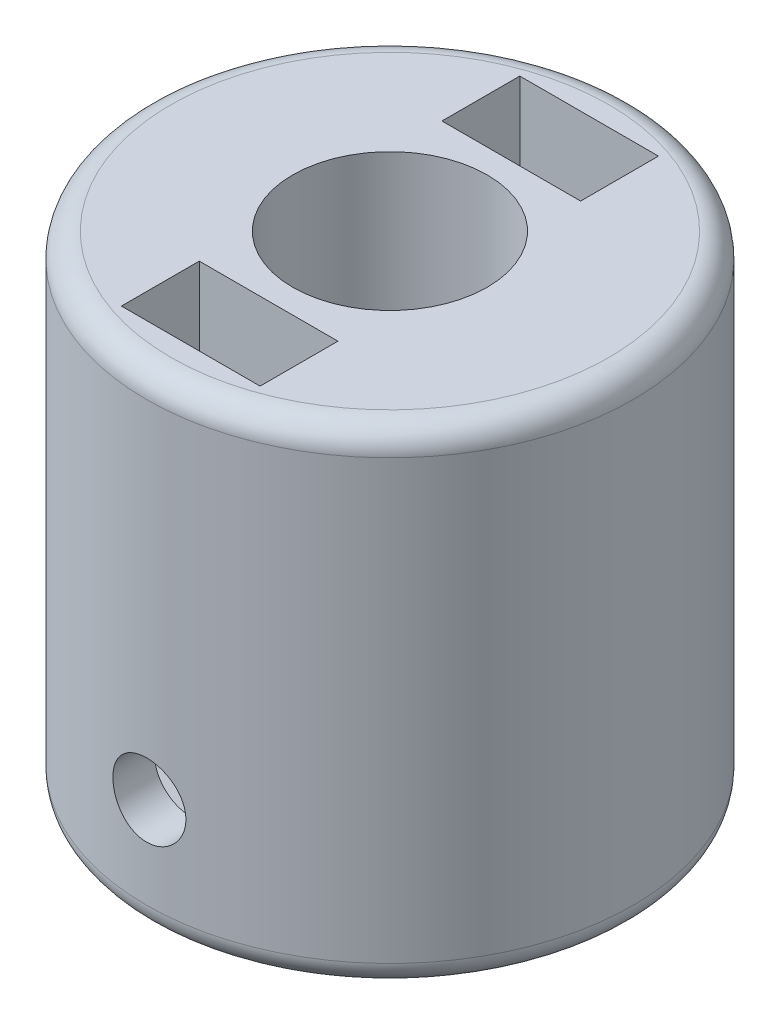
ISO-10303-21;
HEADER;
FILE_DESCRIPTION(('STEP AP214'),'2;1');
FILE_NAME('part.step','',(''),(''),'','','');
FILE_SCHEMA(('AUTOMOTIVE_DESIGN { 1 0 10303 214 1 1 1 1 }'));
ENDSEC;
DATA;
#1=APPLICATION_CONTEXT('core data for automotive mechanical design processes');
#2=APPLICATION_PROTOCOL_DEFINITION('international standard','automotive_design',2000,#1);
#3=PRODUCT_CONTEXT('',#1,'mechanical');
#4=PRODUCT('Part','Part','',(#3));
#5=PRODUCT_RELATED_PRODUCT_CATEGORY('part','',(#4));
#6=PRODUCT_DEFINITION_FORMATION('','',#4);
#7=PRODUCT_DEFINITION_CONTEXT('part definition',#1,'design');
#8=PRODUCT_DEFINITION('design','',#6,#7);
#9=PRODUCT_DEFINITION_SHAPE('','',#8);
#10=(LENGTH_UNIT() NAMED_UNIT(*) SI_UNIT(.MILLI.,.METRE.));
#11=(NAMED_UNIT(*) PLANE_ANGLE_UNIT() SI_UNIT($,.RADIAN.));
#12=(NAMED_UNIT(*) SI_UNIT($,.STERADIAN.) SOLID_ANGLE_UNIT());
#13=UNCERTAINTY_MEASURE_WITH_UNIT(LENGTH_MEASURE(1.E-05),#10,'distance_accuracy_value','');
#14=(GEOMETRIC_REPRESENTATION_CONTEXT(3) GLOBAL_UNCERTAINTY_ASSIGNED_CONTEXT((#13)) GLOBAL_UNIT_ASSIGNED_CONTEXT((#10,
#11,#12)) REPRESENTATION_CONTEXT('',''));
#15=CARTESIAN_POINT('',(0.,0.,0.));
#16=DIRECTION('',(0.,0.,1.));
#17=DIRECTION('',(1.,0.,0.));
#18=AXIS2_PLACEMENT_3D('',#15,#16,#17);
#19=CARTESIAN_POINT('',(0.,20.,0.));
#20=DIRECTION('',(0.,-1.,0.));
#21=DIRECTION('',(0.,0.,-1.));
#22=AXIS2_PLACEMENT_3D('',#19,#20,#21);
#23=CYLINDRICAL_SURFACE('',#22,10.);
#24=CARTESIAN_POINT('',(0.,1.,0.));
#25=DIRECTION('',(0.,1.,0.));
#26=DIRECTION('',(0.,0.,1.));
#27=AXIS2_PLACEMENT_3D('',#24,#25,#26);
#28=CIRCLE('',#27,10.);
#29=CARTESIAN_POINT('',(0.,1.,10.));
#30=VERTEX_POINT('',#29);
#31=EDGE_CURVE('E247',#30,#30,#28,.T.);
#32=ORIENTED_EDGE('',*,*,#31,.T.);
#33=EDGE_LOOP('',(#32));
#34=FACE_BOUND('',#33,.T.);
#35=CARTESIAN_POINT('',(0.,19.,0.));
#36=DIRECTION('',(0.,1.,0.));
#37=DIRECTION('',(0.,0.,1.));
#38=AXIS2_PLACEMENT_3D('',#35,#36,#37);
#39=CIRCLE('',#38,10.);
#40=CARTESIAN_POINT('',(0.,19.,10.));
#41=VERTEX_POINT('',#40);
#42=EDGE_CURVE('E240',#41,#41,#39,.F.);
#43=ORIENTED_EDGE('',*,*,#42,.T.);
#44=EDGE_LOOP('',(#43));
#45=FACE_BOUND('',#44,.T.);
#46=CARTESIAN_POINT('',(0.,15.3368070885338,-10.));
#47=CARTESIAN_POINT('',(0.083751544481642,15.3368036347185,-9.99999865771297));
#48=CARTESIAN_POINT('',(0.167551685082132,15.3297690876931,-9.9989368253704));
#49=CARTESIAN_POINT('',(0.332809627994913,15.301823888551,-9.99480315973187));
#50=CARTESIAN_POINT('',(0.414265068974229,15.2808997255889,-9.99172936938473));
#51=CARTESIAN_POINT('',(0.572418086221859,15.2258145835661,-9.98391721219526));
#52=CARTESIAN_POINT('',(0.649119207826798,15.1916636090278,-9.97918010370919));
#53=CARTESIAN_POINT('',(0.795690428635253,15.1111187091169,-9.96856475911724));
#54=CARTESIAN_POINT('',(0.865561474725188,15.0647264841164,-9.96268668152773));
#55=CARTESIAN_POINT('',(0.997046719562125,14.9606298235939,-9.95039170991452));
#56=CARTESIAN_POINT('',(1.0585998322255,14.9028486323256,-9.94397133890331));
#57=CARTESIAN_POINT('',(1.17117490668948,14.7777793996399,-9.93134261133238));
#58=CARTESIAN_POINT('',(1.22219626272936,14.7104908117552,-9.92513426698505));
#59=CARTESIAN_POINT('',(1.31249729499943,14.5679064450113,-9.91359877458726));
#60=CARTESIAN_POINT('',(1.35171787037205,14.4925728415524,-9.90827611975031));
#61=CARTESIAN_POINT('',(1.41692632171056,14.3362942678883,-9.89916211306268));
#62=CARTESIAN_POINT('',(1.44291491889163,14.2553496037899,-9.89537067775449));
#63=CARTESIAN_POINT('',(1.48073198798911,14.0907890466621,-9.88978256218673));
#64=CARTESIAN_POINT('',(1.49266503640518,14.0071976951257,-9.8879711574125));
#65=CARTESIAN_POINT('',(1.50235624033932,13.8391809225465,-9.88650348970582));
#66=CARTESIAN_POINT('',(1.50011520973796,13.7547555496713,-9.88684710303147));
#67=CARTESIAN_POINT('',(1.48160733250788,13.5882060083396,-9.88963718352409));
#68=CARTESIAN_POINT('',(1.4654569592775,13.506068562049,-9.89206618761549));
#69=CARTESIAN_POINT('',(1.41977117403734,13.3456827196622,-9.89872608126367));
#70=CARTESIAN_POINT('',(1.39023538337812,13.267434433653,-9.90295702179379));
#71=CARTESIAN_POINT('',(1.31849603529736,13.1166937172509,-9.91276335545481));
#72=CARTESIAN_POINT('',(1.27624314283198,13.0442251194414,-9.91834396766526));
#73=CARTESIAN_POINT('',(1.18030413128955,12.9073624927518,-9.93021707574548));
#74=CARTESIAN_POINT('',(1.12661726182478,12.8429689942644,-9.93650961832501));
#75=CARTESIAN_POINT('',(1.00869493078248,12.7234094277941,-9.94917473056209));
#76=CARTESIAN_POINT('',(0.944359329642002,12.6683420982474,-9.95554747112815));
#77=CARTESIAN_POINT('',(0.807307089894187,12.5697711540265,-9.96759647648462));
#78=CARTESIAN_POINT('',(0.734590414588171,12.5262675899899,-9.9732727382251));
#79=CARTESIAN_POINT('',(0.582754598213687,12.4520540020342,-9.98329515585393));
#80=CARTESIAN_POINT('',(0.503631677836781,12.4213515966935,-9.98764051925428));
#81=CARTESIAN_POINT('',(0.341273182487062,12.3736976988484,-9.99450490557069));
#82=CARTESIAN_POINT('',(0.258037885952602,12.3567452767182,-9.99702405195467));
#83=CARTESIAN_POINT('',(0.0906695676436471,12.3372038587171,-9.99993581133871));
#84=CARTESIAN_POINT('',(0.00655273187047109,12.3344791171544,-10.0003485209039));
#85=CARTESIAN_POINT('',(-0.160936677662282,12.3431100938448,-9.99905561015226));
#86=CARTESIAN_POINT('',(-0.244309274381876,12.3544653762019,-9.99735005541368));
#87=CARTESIAN_POINT('',(-0.407532387431407,12.3908211887113,-9.99202468615333));
#88=CARTESIAN_POINT('',(-0.487397963079837,12.4157555845646,-9.98841415207984));
#89=CARTESIAN_POINT('',(-0.641814958642999,12.4784920859955,-9.97968235658369));
#90=CARTESIAN_POINT('',(-0.716366128795099,12.5162947958674,-9.97456102421565));
#91=CARTESIAN_POINT('',(-0.85863497929192,12.6040133130976,-9.96332682468686));
#92=CARTESIAN_POINT('',(-0.926299009891565,12.6540152285465,-9.95720701626745));
#93=CARTESIAN_POINT('',(-1.05232367317771,12.7645929001625,-9.94467863012165));
#94=CARTESIAN_POINT('',(-1.1106837647934,12.8251692708584,-9.93827003562867));
#95=CARTESIAN_POINT('',(-1.21693784957195,12.9557806217103,-9.92582264304494));
#96=CARTESIAN_POINT('',(-1.26474084747421,13.0258900137285,-9.91978736017588));
#97=CARTESIAN_POINT('',(-1.34789129270584,13.1732231290455,-9.90883219104903));
#98=CARTESIAN_POINT('',(-1.38323907656436,13.2504466600552,-9.90391227465628));
#99=CARTESIAN_POINT('',(-1.44033467323943,13.4095446221569,-9.89577033008645));
#100=CARTESIAN_POINT('',(-1.46213037141635,13.491401549505,-9.89254233006438));
#101=CARTESIAN_POINT('',(-1.49165549501586,13.6576661039689,-9.88813382297802));
#102=CARTESIAN_POINT('',(-1.49938589183066,13.7420735545284,-9.88695317451771));
#103=CARTESIAN_POINT('',(-1.5005378666944,13.9101361518495,-9.88677832610841));
#104=CARTESIAN_POINT('',(-1.49410252167313,13.9937903302907,-9.88776226333502));
#105=CARTESIAN_POINT('',(-1.46741229544379,14.1588123518573,-9.89175820611174));
#106=CARTESIAN_POINT('',(-1.44715743638627,14.2401801986472,-9.89477020841118));
#107=CARTESIAN_POINT('',(-1.39345373518665,14.3982801707681,-9.90247526112297));
#108=CARTESIAN_POINT('',(-1.36001489324314,14.4750157589672,-9.90716703716075));
#109=CARTESIAN_POINT('',(-1.28090667642309,14.6218107223362,-9.91770454557702));
#110=CARTESIAN_POINT('',(-1.23523688741502,14.6918698713374,-9.92355031702724));
#111=CARTESIAN_POINT('',(-1.13244337659164,14.8240501465089,-9.93580743364938));
#112=CARTESIAN_POINT('',(-1.07521369039806,14.8860884217808,-9.94222367881967));
#113=CARTESIAN_POINT('',(-0.951148841082836,14.9997316433216,-9.95485788826636));
#114=CARTESIAN_POINT('',(-0.884311448350942,15.0513341611099,-9.96107580610759));
#115=CARTESIAN_POINT('',(-0.742495707543722,15.1428947651411,-9.9726518579052));
#116=CARTESIAN_POINT('',(-0.667474576764761,15.1827871977485,-9.9780050712882));
#117=CARTESIAN_POINT('',(-0.51175187024872,15.2493456052918,-9.98720028802959));
#118=CARTESIAN_POINT('',(-0.431056277096705,15.2760252785875,-9.99104385565757));
#119=CARTESIAN_POINT('',(-0.29166572788933,15.3093484312439,-9.99590939261505));
#120=CARTESIAN_POINT('',(-0.233831133495279,15.3196296900726,-9.99743549179557));
#121=CARTESIAN_POINT('',(-0.117338971600125,15.3333601862464,-9.99948125947896));
#122=CARTESIAN_POINT('',(-0.0586814143344171,15.3368095084863,-10.0000009404877));
#123=CARTESIAN_POINT('',(0.,15.3368070885338,-10.));
#124=B_SPLINE_CURVE_WITH_KNOTS('',3,(#46,#47,#48,#49,#50,#51,#52,#53,#54,#55,#56,#57,#58,#59,
#60,#61,#62,#63,#64,#65,#66,#67,#68,#69,#70,#71,#72,#73,#74,#75,#76,#77,#78,#79,#80,#81,#82,#83,
#84,#85,#86,#87,#88,#89,#90,#91,#92,#93,#94,#95,#96,#97,#98,#99,#100,#101,#102,#103,#104,#105,
#106,#107,#108,#109,#110,#111,#112,#113,#114,#115,#116,#117,#118,#119,#120,#121,#122,#123),
.UNSPECIFIED.,.T.,.F.,(4,2,2,2,2,2,2,2,2,2,2,2,2,2,2,2,2,2,2,2,2,2,2,2,2,2,2,2,2,2,2,2,2,2,2,2,
2,2,4),(0.,0.251040205031663,0.50232496292915,0.753420023583236,1.0044802241976,
1.25729416136843,1.5101226357258,1.76419702395375,2.01825756225506,2.27041564605924,
2.52255925098982,2.77261177195746,3.02267136690361,3.27371383476159,3.52477278308534,
3.77834291255408,4.03191415238668,4.28563608984874,4.53934087193401,4.79062058544255,
5.04189251991155,5.29195148965948,5.54202220376273,5.79391188036907,6.04581620028629,
6.29981366584672,6.55380426808832,6.80689223457168,7.05996272137176,7.31048888261064,
7.56101464229564,7.81135073984146,8.06169531466879,8.3144482996572,8.56726003468733,
8.82146323384733,9.07540233261441,9.25129851978808,9.42719252123291),.UNSPECIFIED.);
#125=CARTESIAN_POINT('',(0.,15.3368070885338,-10.));
#126=VERTEX_POINT('',#125);
#127=EDGE_CURVE('E273',#126,#126,#124,.T.);
#128=ORIENTED_EDGE('',*,*,#127,.F.);
#129=EDGE_LOOP('',(#128));
#130=FACE_BOUND('',#129,.T.);
#131=CARTESIAN_POINT('',(-1.50000000000001,4.74830377210179,9.88685996664259));
#132=CARTESIAN_POINT('',(-1.49999654107285,4.66455820281184,9.88686136668593));
#133=CARTESIAN_POINT('',(-1.49296296388492,4.58076402135108,9.88793551739101));
#134=CARTESIAN_POINT('',(-1.46502196657002,4.41551845721866,9.8921131480324));
#135=CARTESIAN_POINT('',(-1.44410101402629,4.33406944062178,9.8952186073143));
#136=CARTESIAN_POINT('',(-1.38902526098085,4.17593001665489,9.90309938986228));
#137=CARTESIAN_POINT('',(-1.35488061681398,4.09923600955963,9.90787343131536));
#138=CARTESIAN_POINT('',(-1.27435063087792,3.95267674132971,9.91855194113145));
#139=CARTESIAN_POINT('',(-1.22796697429873,3.88281054188749,9.92445625383668));
#140=CARTESIAN_POINT('',(-1.12387902418559,3.75131995534746,9.93678289248039));
#141=CARTESIAN_POINT('',(-1.06609605584821,3.68975815869505,9.94320862458057));
#142=CARTESIAN_POINT('',(-0.941019605444382,3.57716628644629,9.95582368169047));
#143=CARTESIAN_POINT('',(-0.873725600786538,3.5261367899348,9.96201299368615));
#144=CARTESIAN_POINT('',(-0.731136358052753,3.43582714041043,9.97349347428185));
#145=CARTESIAN_POINT('',(-0.655804227365775,3.39660462177933,9.97878018435569));
#146=CARTESIAN_POINT('',(-0.499528850106983,3.33139217329361,9.98782206746405));
#147=CARTESIAN_POINT('',(-0.418585900270685,3.3054015442589,9.99157732141944));
#148=CARTESIAN_POINT('',(-0.254031123090578,3.26758038357095,9.99710914797782));
#149=CARTESIAN_POINT('',(-0.170443884389875,3.25564504571463,9.99890035887344));
#150=CARTESIAN_POINT('',(-0.00243520401948738,3.24594783727689,10.0003524476958));
#151=CARTESIAN_POINT('',(0.081986191015738,3.2481851787821,10.0000134440494));
#152=CARTESIAN_POINT('',(0.248551718200512,3.26668710986422,9.99725499660796));
#153=CARTESIAN_POINT('',(0.3307086914,3.28283894389327,9.99485227652479));
#154=CARTESIAN_POINT('',(0.49113282914313,3.32853437842437,9.98825500227851));
#155=CARTESIAN_POINT('',(0.569399893513473,3.35807832360323,9.98406040199739));
#156=CARTESIAN_POINT('',(0.720163780770309,3.42983476901889,9.97432193873206));
#157=CARTESIAN_POINT('',(0.792637672323588,3.47209473721053,9.96877303515638));
#158=CARTESIAN_POINT('',(0.929507907150169,3.56804896577178,9.95694438245421));
#159=CARTESIAN_POINT('',(0.993903718271727,3.62174397880866,9.95066458523184));
#160=CARTESIAN_POINT('',(1.11345448272264,3.73967222092838,9.93800158192627));
#161=CARTESIAN_POINT('',(1.16851232950946,3.8040038940719,9.93161796623257));
#162=CARTESIAN_POINT('',(1.26706599338812,3.94104484922553,9.91952704453523));
#163=CARTESIAN_POINT('',(1.31056173927998,4.01375418282171,9.91381974269649));
#164=CARTESIAN_POINT('',(1.38476964534604,4.16558773504243,9.90372775286855));
#165=CARTESIAN_POINT('',(1.41547182270081,4.24471690576418,9.89934409845291));
#166=CARTESIAN_POINT('',(1.46312336208878,4.40708902724918,9.89241402899059));
#167=CARTESIAN_POINT('',(1.48007369337325,4.49033168764854,9.88986748446299));
#168=CARTESIAN_POINT('',(1.49960720086655,4.65770386167928,9.88692451395027));
#169=CARTESIAN_POINT('',(1.50232803265051,4.74181696030332,9.88650748802574));
#170=CARTESIAN_POINT('',(1.49369057019818,4.90929796691913,9.88781607937153));
#171=CARTESIAN_POINT('',(1.48233271282301,4.99266589795256,9.88954163015778));
#172=CARTESIAN_POINT('',(1.44597702952765,5.15586359006742,9.89492202461453));
#173=CARTESIAN_POINT('',(1.4210477852782,5.23570897704339,9.89856716482858));
#174=CARTESIAN_POINT('',(1.35832831947086,5.3900878641504,9.90736801825768));
#175=CARTESIAN_POINT('',(1.32053746276388,5.46462110172999,9.91252380607176));
#176=CARTESIAN_POINT('',(1.23283677995323,5.60687703243683,9.92381355687063));
#177=CARTESIAN_POINT('',(1.18283784561765,5.67454421938161,9.92995459279988));
#178=CARTESIAN_POINT('',(1.07226416837201,5.8005766319756,9.94250159433355));
#179=CARTESIAN_POINT('',(1.01168882744679,5.85894133128294,9.94890757490292));
#180=CARTESIAN_POINT('',(0.881075619628175,5.96520637873537,9.96132705217386));
#181=CARTESIAN_POINT('',(0.810963126771948,6.01301550034427,9.96733683460423));
#182=CARTESIAN_POINT('',(0.663622080263672,6.09617667736443,9.97822905032016));
#183=CARTESIAN_POINT('',(0.58639372136043,6.13152907356682,9.98311151444563));
#184=CARTESIAN_POINT('',(0.427297995861138,6.18862751458982,9.99118269660795));
#185=CARTESIAN_POINT('',(0.345448858754294,6.21042343918015,9.99437761717899));
#186=CARTESIAN_POINT('',(0.179200815501185,6.23995165163926,9.99873976656896));
#187=CARTESIAN_POINT('',(0.0948020781305728,6.24768486835093,9.99990712930801));
#188=CARTESIAN_POINT('',(-0.0732645908608264,6.24884547665119,10.0000812905914));
#189=CARTESIAN_POINT('',(-0.15693157021206,6.24241245297877,9.99910917023796));
#190=CARTESIAN_POINT('',(-0.321979795323115,6.21572238368103,9.99515610519141));
#191=CARTESIAN_POINT('',(-0.403361048396521,6.19546538229323,9.99217516692666));
#192=CARTESIAN_POINT('',(-0.561489374379669,6.14175189653155,9.98453786742463));
#193=CARTESIAN_POINT('',(-0.63823979314879,6.10830507696286,9.97988273316947));
#194=CARTESIAN_POINT('',(-0.78506111789661,6.02917628411865,9.96940834495499));
#195=CARTESIAN_POINT('',(-0.855131806920717,5.98349391362145,9.96358905320338));
#196=CARTESIAN_POINT('',(-0.987312585191968,5.88068607327262,9.95136510636178));
#197=CARTESIAN_POINT('',(-1.04934206644639,5.82345754628545,9.94495548425941));
#198=CARTESIAN_POINT('',(-1.16296808390269,5.69939869902132,9.93231001689001));
#199=CARTESIAN_POINT('',(-1.21456216798985,5.63256612827744,9.92607421276291));
#200=CARTESIAN_POINT('',(-1.30611310822975,5.49075478886926,9.91444484029116));
#201=CARTESIAN_POINT('',(-1.3460029429121,5.41573235507996,9.90905620156985));
#202=CARTESIAN_POINT('',(-1.41255613872046,5.26000699533849,9.89978909110724));
#203=CARTESIAN_POINT('',(-1.43923322574898,5.17931006424397,9.89590905307931));
#204=CARTESIAN_POINT('',(-1.47254951890027,5.03992633584531,9.89099485524825));
#205=CARTESIAN_POINT('',(-1.48282769780421,4.98210037517752,9.88945249382379));
#206=CARTESIAN_POINT('',(-1.49655410576575,4.86562548036744,9.88738456567011));
#207=CARTESIAN_POINT('',(-1.50000242335077,4.80697655690218,9.88685898576155));
#208=CARTESIAN_POINT('',(-1.50000000000001,4.74830377210179,9.88685996664259));
#209=B_SPLINE_CURVE_WITH_KNOTS('',3,(#131,#132,#133,#134,#135,#136,#137,#138,#139,#140,#141,
#142,#143,#144,#145,#146,#147,#148,#149,#150,#151,#152,#153,#154,#155,#156,#157,#158,#159,#160,
#161,#162,#163,#164,#165,#166,#167,#168,#169,#170,#171,#172,#173,#174,#175,#176,#177,#178,#179,
#180,#181,#182,#183,#184,#185,#186,#187,#188,#189,#190,#191,#192,#193,#194,#195,#196,#197,#198,
#199,#200,#201,#202,#203,#204,#205,#206,#207,#208),.UNSPECIFIED.,.T.,.F.,(4,2,2,2,2,2,2,2,2,2,2,
2,2,2,2,2,2,2,2,2,2,2,2,2,2,2,2,2,2,2,2,2,2,2,2,2,2,2,4),(0.,0.251022251804869,
0.502289469561802,0.753364085335674,1.00440414866133,1.25724158649107,1.51009292207817,
1.76415922105782,2.01821209364501,2.27035832534397,2.52249053939374,2.77259862515728,
3.02271314839401,3.27377316386454,3.52484970949272,3.77839544666269,4.0319427451435,
4.28568751773138,4.53941440444341,4.79068214603744,5.04194209099918,5.29194394807374,
5.54195815286117,5.79385486001302,6.04576581461802,6.29977537753516,6.55377799071854,
6.8068404089109,7.05988611170473,7.31044963622326,7.56101235892823,7.81139182257833,
8.06177941567106,8.31450950010969,8.56729890236862,8.82150878824931,9.07545403445564,
9.25132441891613,9.42719252376192),.UNSPECIFIED.);
#210=CARTESIAN_POINT('',(-1.50000000000001,4.74830377210179,9.88685996664259));
#211=VERTEX_POINT('',#210);
#212=EDGE_CURVE('E276',#211,#211,#209,.T.);
#213=ORIENTED_EDGE('',*,*,#212,.F.);
#214=EDGE_LOOP('',(#213));
#215=FACE_BOUND('',#214,.T.);
#216=ADVANCED_FACE('F38',(#34,#45,#130,#215),#23,.T.);
#217=CARTESIAN_POINT('',(0.,20.,0.));
#218=DIRECTION('',(0.,-1.,0.));
#219=DIRECTION('',(0.,0.,-1.));
#220=AXIS2_PLACEMENT_3D('',#217,#218,#219);
#221=CYLINDRICAL_SURFACE('',#220,3.175);
#222=CARTESIAN_POINT('',(0.,0.,0.));
#223=DIRECTION('',(0.,1.,0.));
#224=DIRECTION('',(0.,0.,1.));
#225=AXIS2_PLACEMENT_3D('',#222,#223,#224);
#226=CIRCLE('',#225,3.175);
#227=CARTESIAN_POINT('',(0.,0.,3.175));
#228=VERTEX_POINT('',#227);
#229=EDGE_CURVE('E228',#228,#228,#226,.T.);
#230=ORIENTED_EDGE('',*,*,#229,.F.);
#231=EDGE_LOOP('',(#230));
#232=FACE_BOUND('',#231,.T.);
#233=CARTESIAN_POINT('',(0.,10.7,0.));
#234=DIRECTION('',(0.,1.,0.));
#235=DIRECTION('',(0.,0.,1.));
#236=AXIS2_PLACEMENT_3D('',#233,#234,#235);
#237=CIRCLE('',#236,3.175);
#238=CARTESIAN_POINT('',(0.,10.7,3.175));
#239=VERTEX_POINT('',#238);
#240=EDGE_CURVE('E167',#239,#239,#237,.T.);
#241=ORIENTED_EDGE('',*,*,#240,.T.);
#242=EDGE_LOOP('',(#241));
#243=FACE_BOUND('',#242,.T.);
#244=ADVANCED_FACE('F266',(#232,#243),#221,.F.);
#245=CARTESIAN_POINT('',(0.,20.,0.));
#246=DIRECTION('',(0.,1.,0.));
#247=DIRECTION('',(0.,0.,1.));
#248=AXIS2_PLACEMENT_3D('',#245,#246,#247);
#249=PLANE('',#248);
#250=CARTESIAN_POINT('',(0.,20.,0.));
#251=DIRECTION('',(0.,1.,0.));
#252=DIRECTION('',(0.,0.,1.));
#253=AXIS2_PLACEMENT_3D('',#250,#251,#252);
#254=CIRCLE('',#253,9.);
#255=CARTESIAN_POINT('',(0.,20.,9.));
#256=VERTEX_POINT('',#255);
#257=EDGE_CURVE('E11',#256,#256,#254,.T.);
#258=ORIENTED_EDGE('',*,*,#257,.T.);
#259=EDGE_LOOP('',(#258));
#260=FACE_BOUND('',#259,.T.);
#261=DIRECTION('',(1.,0.,0.));
#262=VECTOR('',#261,1.);
#263=CARTESIAN_POINT('',(-2.85,20.,-4.9875));
#264=LINE('',#263,#262);
#265=CARTESIAN_POINT('',(-2.85,20.,-4.9875));
#266=VERTEX_POINT('',#265);
#267=CARTESIAN_POINT('',(2.85,20.,-4.9875));
#268=VERTEX_POINT('',#267);
#269=EDGE_CURVE('E55',#266,#268,#264,.T.);
#270=ORIENTED_EDGE('',*,*,#269,.F.);
#271=DIRECTION('',(0.,0.,1.));
#272=VECTOR('',#271,1.);
#273=CARTESIAN_POINT('',(-2.85,20.,-4.9875));
#274=LINE('',#273,#272);
#275=CARTESIAN_POINT('',(-2.85,20.,-8.1875));
#276=VERTEX_POINT('',#275);
#277=EDGE_CURVE('E146',#276,#266,#274,.T.);
#278=ORIENTED_EDGE('',*,*,#277,.F.);
#279=DIRECTION('',(-1.,0.,0.));
#280=VECTOR('',#279,1.);
#281=CARTESIAN_POINT('',(-2.85,20.,-8.1875));
#282=LINE('',#281,#280);
#283=CARTESIAN_POINT('',(2.85,20.,-8.1875));
#284=VERTEX_POINT('',#283);
#285=EDGE_CURVE('E554',#284,#276,#282,.T.);
#286=ORIENTED_EDGE('',*,*,#285,.F.);
#287=DIRECTION('',(0.,0.,-1.));
#288=VECTOR('',#287,1.);
#289=CARTESIAN_POINT('',(2.85,20.,-4.9875));
#290=LINE('',#289,#288);
#291=EDGE_CURVE('E150',#268,#284,#290,.T.);
#292=ORIENTED_EDGE('',*,*,#291,.F.);
#293=EDGE_LOOP('',(#270,#278,#286,#292));
#294=FACE_BOUND('',#293,.T.);
#295=CARTESIAN_POINT('',(0.,20.,0.));
#296=DIRECTION('',(0.,1.,0.));
#297=DIRECTION('',(0.,0.,1.));
#298=AXIS2_PLACEMENT_3D('',#295,#296,#297);
#299=CIRCLE('',#298,4.);
#300=CARTESIAN_POINT('',(0.,20.,4.));
#301=VERTEX_POINT('',#300);
#302=EDGE_CURVE('E168',#301,#301,#299,.T.);
#303=ORIENTED_EDGE('',*,*,#302,.F.);
#304=EDGE_LOOP('',(#303));
#305=FACE_BOUND('',#304,.T.);
#306=DIRECTION('',(0.,0.,-1.));
#307=VECTOR('',#306,1.);
#308=CARTESIAN_POINT('',(2.85,20.,4.9875));
#309=LINE('',#308,#307);
#310=CARTESIAN_POINT('',(2.85,20.,8.1875));
#311=VERTEX_POINT('',#310);
#312=CARTESIAN_POINT('',(2.85,20.,4.9875));
#313=VERTEX_POINT('',#312);
#314=EDGE_CURVE('E63',#311,#313,#309,.T.);
#315=ORIENTED_EDGE('',*,*,#314,.F.);
#316=DIRECTION('',(1.,0.,0.));
#317=VECTOR('',#316,1.);
#318=CARTESIAN_POINT('',(-2.85,20.,8.1875));
#319=LINE('',#318,#317);
#320=CARTESIAN_POINT('',(-2.85,20.,8.1875));
#321=VERTEX_POINT('',#320);
#322=EDGE_CURVE('E204',#321,#311,#319,.T.);
#323=ORIENTED_EDGE('',*,*,#322,.F.);
#324=DIRECTION('',(0.,0.,1.));
#325=VECTOR('',#324,1.);
#326=CARTESIAN_POINT('',(-2.85,20.,4.9875));
#327=LINE('',#326,#325);
#328=CARTESIAN_POINT('',(-2.85,20.,4.9875));
#329=VERTEX_POINT('',#328);
#330=EDGE_CURVE('E218',#329,#321,#327,.T.);
#331=ORIENTED_EDGE('',*,*,#330,.F.);
#332=DIRECTION('',(-1.,0.,0.));
#333=VECTOR('',#332,1.);
#334=CARTESIAN_POINT('',(-2.85,20.,4.9875));
#335=LINE('',#334,#333);
#336=EDGE_CURVE('E214',#313,#329,#335,.T.);
#337=ORIENTED_EDGE('',*,*,#336,.F.);
#338=EDGE_LOOP('',(#315,#323,#331,#337));
#339=FACE_BOUND('',#338,.T.);
#340=ADVANCED_FACE('F364',(#260,#294,#305,#339),#249,.T.);
#341=CARTESIAN_POINT('',(0.,0.,0.));
#342=DIRECTION('',(0.,1.,0.));
#343=DIRECTION('',(0.,0.,1.));
#344=AXIS2_PLACEMENT_3D('',#341,#342,#343);
#345=PLANE('',#344);
#346=CARTESIAN_POINT('',(0.,0.,0.));
#347=DIRECTION('',(0.,1.,0.));
#348=DIRECTION('',(0.,0.,1.));
#349=AXIS2_PLACEMENT_3D('',#346,#347,#348);
#350=CIRCLE('',#349,9.);
#351=CARTESIAN_POINT('',(0.,0.,9.));
#352=VERTEX_POINT('',#351);
#353=EDGE_CURVE('E48',#352,#352,#350,.F.);
#354=ORIENTED_EDGE('',*,*,#353,.T.);
#355=EDGE_LOOP('',(#354));
#356=FACE_BOUND('',#355,.T.);
#357=ORIENTED_EDGE('',*,*,#229,.T.);
#358=EDGE_LOOP('',(#357));
#359=FACE_BOUND('',#358,.T.);
#360=ADVANCED_FACE('F255',(#356,#359),#345,.F.);
#361=CARTESIAN_POINT('',(2.85,3.,4.9875));
#362=DIRECTION('',(1.,0.,0.));
#363=DIRECTION('',(0.,0.,-1.));
#364=AXIS2_PLACEMENT_3D('',#361,#362,#363);
#365=PLANE('',#364);
#366=ORIENTED_EDGE('',*,*,#314,.T.);
#367=DIRECTION('',(0.,1.,0.));
#368=VECTOR('',#367,1.);
#369=CARTESIAN_POINT('',(2.85,3.,4.9875));
#370=LINE('',#369,#368);
#371=CARTESIAN_POINT('',(2.85,3.,4.9875));
#372=VERTEX_POINT('',#371);
#373=EDGE_CURVE('E211',#372,#313,#370,.T.);
#374=ORIENTED_EDGE('',*,*,#373,.F.);
#375=DIRECTION('',(0.,0.,-1.));
#376=VECTOR('',#375,1.);
#377=CARTESIAN_POINT('',(2.85,3.,4.9875));
#378=LINE('',#377,#376);
#379=CARTESIAN_POINT('',(2.85,3.,8.1875));
#380=VERTEX_POINT('',#379);
#381=EDGE_CURVE('E200',#380,#372,#378,.T.);
#382=ORIENTED_EDGE('',*,*,#381,.F.);
#383=DIRECTION('',(0.,1.,0.));
#384=VECTOR('',#383,1.);
#385=CARTESIAN_POINT('',(2.85,3.,8.1875));
#386=LINE('',#385,#384);
#387=EDGE_CURVE('E225',#380,#311,#386,.T.);
#388=ORIENTED_EDGE('',*,*,#387,.T.);
#389=EDGE_LOOP('',(#366,#374,#382,#388));
#390=FACE_BOUND('',#389,.T.);
#391=ADVANCED_FACE('F352',(#390),#365,.F.);
#392=CARTESIAN_POINT('',(-2.85,3.,8.1875));
#393=DIRECTION('',(0.,0.,1.));
#394=DIRECTION('',(1.,0.,0.));
#395=AXIS2_PLACEMENT_3D('',#392,#393,#394);
#396=PLANE('',#395);
#397=CARTESIAN_POINT('',(0.,4.74830377210179,8.1875));
#398=DIRECTION('',(0.,0.,1.));
#399=DIRECTION('',(1.,0.,0.));
#400=AXIS2_PLACEMENT_3D('',#397,#398,#399);
#401=CIRCLE('',#400,1.5);
#402=CARTESIAN_POINT('',(1.49999999999999,4.74830377210179,8.1875));
#403=VERTEX_POINT('',#402);
#404=EDGE_CURVE('E279',#403,#403,#401,.F.);
#405=ORIENTED_EDGE('',*,*,#404,.F.);
#406=EDGE_LOOP('',(#405));
#407=FACE_BOUND('',#406,.T.);
#408=ORIENTED_EDGE('',*,*,#322,.T.);
#409=ORIENTED_EDGE('',*,*,#387,.F.);
#410=DIRECTION('',(1.,0.,0.));
#411=VECTOR('',#410,1.);
#412=CARTESIAN_POINT('',(-2.85,3.,8.1875));
#413=LINE('',#412,#411);
#414=CARTESIAN_POINT('',(-2.85,3.,8.1875));
#415=VERTEX_POINT('',#414);
#416=EDGE_CURVE('E208',#415,#380,#413,.T.);
#417=ORIENTED_EDGE('',*,*,#416,.F.);
#418=DIRECTION('',(0.,1.,0.));
#419=VECTOR('',#418,1.);
#420=CARTESIAN_POINT('',(-2.85,3.,8.1875));
#421=LINE('',#420,#419);
#422=EDGE_CURVE('E229',#415,#321,#421,.T.);
#423=ORIENTED_EDGE('',*,*,#422,.T.);
#424=EDGE_LOOP('',(#408,#409,#417,#423));
#425=FACE_BOUND('',#424,.T.);
#426=ADVANCED_FACE('F348',(#407,#425),#396,.F.);
#427=CARTESIAN_POINT('',(-2.85,3.,4.9875));
#428=DIRECTION('',(-1.,0.,0.));
#429=DIRECTION('',(0.,0.,1.));
#430=AXIS2_PLACEMENT_3D('',#427,#428,#429);
#431=PLANE('',#430);
#432=ORIENTED_EDGE('',*,*,#330,.T.);
#433=ORIENTED_EDGE('',*,*,#422,.F.);
#434=DIRECTION('',(0.,0.,1.));
#435=VECTOR('',#434,1.);
#436=CARTESIAN_POINT('',(-2.85,3.,4.9875));
#437=LINE('',#436,#435);
#438=CARTESIAN_POINT('',(-2.85,3.,4.9875));
#439=VERTEX_POINT('',#438);
#440=EDGE_CURVE('E203',#439,#415,#437,.T.);
#441=ORIENTED_EDGE('',*,*,#440,.F.);
#442=DIRECTION('',(0.,1.,0.));
#443=VECTOR('',#442,1.);
#444=CARTESIAN_POINT('',(-2.85,3.,4.9875));
#445=LINE('',#444,#443);
#446=EDGE_CURVE('E232',#439,#329,#445,.T.);
#447=ORIENTED_EDGE('',*,*,#446,.T.);
#448=EDGE_LOOP('',(#432,#433,#441,#447));
#449=FACE_BOUND('',#448,.T.);
#450=ADVANCED_FACE('F351',(#449),#431,.F.);
#451=CARTESIAN_POINT('',(-2.85,3.,4.9875));
#452=DIRECTION('',(0.,0.,-1.));
#453=DIRECTION('',(-1.,0.,0.));
#454=AXIS2_PLACEMENT_3D('',#451,#452,#453);
#455=PLANE('',#454);
#456=ORIENTED_EDGE('',*,*,#336,.T.);
#457=ORIENTED_EDGE('',*,*,#446,.F.);
#458=DIRECTION('',(0.878655241109038,-0.477456770055278,0.));
#459=VECTOR('',#458,1.);
#460=CARTESIAN_POINT('',(-2.85,3.,4.9875));
#461=LINE('',#460,#459);
#462=CARTESIAN_POINT('',(0.,1.45132455712664,4.9875));
#463=VERTEX_POINT('',#462);
#464=EDGE_CURVE('E184',#439,#463,#461,.T.);
#465=ORIENTED_EDGE('',*,*,#464,.T.);
#466=DIRECTION('',(0.878655241109038,0.477456770055278,0.));
#467=VECTOR('',#466,1.);
#468=CARTESIAN_POINT('',(0.,1.45132455712664,4.9875));
#469=LINE('',#468,#467);
#470=EDGE_CURVE('E177',#463,#372,#469,.T.);
#471=ORIENTED_EDGE('',*,*,#470,.T.);
#472=ORIENTED_EDGE('',*,*,#373,.T.);
#473=EDGE_LOOP('',(#456,#457,#465,#471,#472));
#474=FACE_BOUND('',#473,.T.);
#475=ADVANCED_FACE('F346',(#474),#455,.F.);
#476=CARTESIAN_POINT('',(2.85,3.,8.2875));
#477=DIRECTION('',(0.,-1.,0.));
#478=DIRECTION('',(0.,0.,-1.));
#479=AXIS2_PLACEMENT_3D('',#476,#477,#478);
#480=PLANE('',#479);
#481=ORIENTED_EDGE('',*,*,#416,.T.);
#482=DIRECTION('',(0.,0.,-1.));
#483=VECTOR('',#482,1.);
#484=CARTESIAN_POINT('',(2.85,3.,8.2875));
#485=LINE('',#484,#483);
#486=CARTESIAN_POINT('',(2.85,3.,8.2875));
#487=VERTEX_POINT('',#486);
#488=EDGE_CURVE('E183',#487,#380,#485,.T.);
#489=ORIENTED_EDGE('',*,*,#488,.F.);
#490=DIRECTION('',(-1.,0.,0.));
#491=VECTOR('',#490,1.);
#492=CARTESIAN_POINT('',(2.85,3.,8.2875));
#493=LINE('',#492,#491);
#494=CARTESIAN_POINT('',(-2.85,3.,8.2875));
#495=VERTEX_POINT('',#494);
#496=EDGE_CURVE('E172',#487,#495,#493,.T.);
#497=ORIENTED_EDGE('',*,*,#496,.T.);
#498=DIRECTION('',(0.,0.,-1.));
#499=VECTOR('',#498,1.);
#500=CARTESIAN_POINT('',(-2.85,3.,8.2875));
#501=LINE('',#500,#499);
#502=EDGE_CURVE('E197',#495,#415,#501,.T.);
#503=ORIENTED_EDGE('',*,*,#502,.T.);
#504=EDGE_LOOP('',(#481,#489,#497,#503));
#505=FACE_BOUND('',#504,.T.);
#506=ADVANCED_FACE('F342',(#505),#480,.T.);
#507=CARTESIAN_POINT('',(-2.85,3.,8.2875));
#508=DIRECTION('',(0.477456770055278,0.878655241109038,0.));
#509=DIRECTION('',(-0.878655241109038,0.477456770055278,0.));
#510=AXIS2_PLACEMENT_3D('',#507,#508,#509);
#511=PLANE('',#510);
#512=ORIENTED_EDGE('',*,*,#464,.F.);
#513=ORIENTED_EDGE('',*,*,#440,.T.);
#514=ORIENTED_EDGE('',*,*,#502,.F.);
#515=DIRECTION('',(0.878655241109038,-0.477456770055278,0.));
#516=VECTOR('',#515,1.);
#517=CARTESIAN_POINT('',(-2.85,3.,8.2875));
#518=LINE('',#517,#516);
#519=CARTESIAN_POINT('',(0.,1.45132455712664,8.2875));
#520=VERTEX_POINT('',#519);
#521=EDGE_CURVE('E176',#495,#520,#518,.T.);
#522=ORIENTED_EDGE('',*,*,#521,.T.);
#523=DIRECTION('',(0.,0.,-1.));
#524=VECTOR('',#523,1.);
#525=CARTESIAN_POINT('',(0.,1.45132455712664,8.2875));
#526=LINE('',#525,#524);
#527=EDGE_CURVE('E193',#520,#463,#526,.T.);
#528=ORIENTED_EDGE('',*,*,#527,.T.);
#529=EDGE_LOOP('',(#512,#513,#514,#522,#528));
#530=FACE_BOUND('',#529,.T.);
#531=ADVANCED_FACE('F338',(#530),#511,.T.);
#532=CARTESIAN_POINT('',(0.,1.45132455712664,8.2875));
#533=DIRECTION('',(-0.477456770055278,0.878655241109038,0.));
#534=DIRECTION('',(-0.878655241109038,-0.477456770055278,0.));
#535=AXIS2_PLACEMENT_3D('',#532,#533,#534);
#536=PLANE('',#535);
#537=ORIENTED_EDGE('',*,*,#470,.F.);
#538=ORIENTED_EDGE('',*,*,#527,.F.);
#539=DIRECTION('',(0.878655241109038,0.477456770055278,0.));
#540=VECTOR('',#539,1.);
#541=CARTESIAN_POINT('',(0.,1.45132455712664,8.2875));
#542=LINE('',#541,#540);
#543=EDGE_CURVE('E180',#520,#487,#542,.T.);
#544=ORIENTED_EDGE('',*,*,#543,.T.);
#545=ORIENTED_EDGE('',*,*,#488,.T.);
#546=ORIENTED_EDGE('',*,*,#381,.T.);
#547=EDGE_LOOP('',(#537,#538,#544,#545,#546));
#548=FACE_BOUND('',#547,.T.);
#549=ADVANCED_FACE('F334',(#548),#536,.T.);
#550=CARTESIAN_POINT('',(0.,0.,8.2875));
#551=DIRECTION('',(0.,0.,1.));
#552=DIRECTION('',(1.,0.,0.));
#553=AXIS2_PLACEMENT_3D('',#550,#551,#552);
#554=PLANE('',#553);
#555=ORIENTED_EDGE('',*,*,#496,.F.);
#556=ORIENTED_EDGE('',*,*,#543,.F.);
#557=ORIENTED_EDGE('',*,*,#521,.F.);
#558=EDGE_LOOP('',(#555,#556,#557));
#559=FACE_BOUND('',#558,.T.);
#560=ADVANCED_FACE('F330',(#559),#554,.F.);
#561=CARTESIAN_POINT('',(0.,10.7,0.));
#562=DIRECTION('',(0.,1.,0.));
#563=DIRECTION('',(0.,0.,1.));
#564=AXIS2_PLACEMENT_3D('',#561,#562,#563);
#565=CYLINDRICAL_SURFACE('',#564,4.);
#566=CARTESIAN_POINT('',(0.,10.7,0.));
#567=DIRECTION('',(0.,1.,0.));
#568=DIRECTION('',(0.,0.,1.));
#569=AXIS2_PLACEMENT_3D('',#566,#567,#568);
#570=CIRCLE('',#569,4.);
#571=CARTESIAN_POINT('',(0.,10.7,4.));
#572=VERTEX_POINT('',#571);
#573=EDGE_CURVE('E163',#572,#572,#570,.T.);
#574=ORIENTED_EDGE('',*,*,#573,.F.);
#575=EDGE_LOOP('',(#574));
#576=FACE_BOUND('',#575,.T.);
#577=ORIENTED_EDGE('',*,*,#302,.T.);
#578=EDGE_LOOP('',(#577));
#579=FACE_BOUND('',#578,.T.);
#580=ADVANCED_FACE('F326',(#576,#579),#565,.F.);
#581=CARTESIAN_POINT('',(0.,10.7,0.));
#582=DIRECTION('',(0.,1.,0.));
#583=DIRECTION('',(0.,0.,1.));
#584=AXIS2_PLACEMENT_3D('',#581,#582,#583);
#585=PLANE('',#584);
#586=ORIENTED_EDGE('',*,*,#240,.F.);
#587=EDGE_LOOP('',(#586));
#588=FACE_BOUND('',#587,.T.);
#589=ORIENTED_EDGE('',*,*,#573,.T.);
#590=EDGE_LOOP('',(#589));
#591=FACE_BOUND('',#590,.T.);
#592=ADVANCED_FACE('F323',(#588,#591),#585,.T.);
#593=CARTESIAN_POINT('',(-2.85,12.2,-4.9875));
#594=DIRECTION('',(0.,0.,1.));
#595=DIRECTION('',(1.,0.,0.));
#596=AXIS2_PLACEMENT_3D('',#593,#594,#595);
#597=PLANE('',#596);
#598=ORIENTED_EDGE('',*,*,#269,.T.);
#599=DIRECTION('',(0.,1.,0.));
#600=VECTOR('',#599,1.);
#601=CARTESIAN_POINT('',(2.85,12.2,-4.9875));
#602=LINE('',#601,#600);
#603=CARTESIAN_POINT('',(2.85,12.2,-4.9875));
#604=VERTEX_POINT('',#603);
#605=EDGE_CURVE('E154',#604,#268,#602,.T.);
#606=ORIENTED_EDGE('',*,*,#605,.F.);
#607=DIRECTION('',(-0.884918222381982,-0.465746432832622,0.));
#608=VECTOR('',#607,1.);
#609=CARTESIAN_POINT('',(2.85,12.2,-4.9875));
#610=LINE('',#609,#608);
#611=CARTESIAN_POINT('',(0.,10.7,-4.9875));
#612=VERTEX_POINT('',#611);
#613=EDGE_CURVE('E142',#604,#612,#610,.T.);
#614=ORIENTED_EDGE('',*,*,#613,.T.);
#615=DIRECTION('',(-0.884918222381983,0.465746432832622,0.));
#616=VECTOR('',#615,1.);
#617=CARTESIAN_POINT('',(0.,10.7,-4.9875));
#618=LINE('',#617,#616);
#619=CARTESIAN_POINT('',(-2.85,12.2,-4.9875));
#620=VERTEX_POINT('',#619);
#621=EDGE_CURVE('E137',#612,#620,#618,.T.);
#622=ORIENTED_EDGE('',*,*,#621,.T.);
#623=DIRECTION('',(0.,1.,0.));
#624=VECTOR('',#623,1.);
#625=CARTESIAN_POINT('',(-2.85,12.2,-4.9875));
#626=LINE('',#625,#624);
#627=EDGE_CURVE('E158',#620,#266,#626,.T.);
#628=ORIENTED_EDGE('',*,*,#627,.T.);
#629=EDGE_LOOP('',(#598,#606,#614,#622,#628));
#630=FACE_BOUND('',#629,.T.);
#631=ADVANCED_FACE('F314',(#630),#597,.F.);
#632=CARTESIAN_POINT('',(-2.85,12.2,-4.9875));
#633=DIRECTION('',(-1.,0.,0.));
#634=DIRECTION('',(0.,0.,1.));
#635=AXIS2_PLACEMENT_3D('',#632,#633,#634);
#636=PLANE('',#635);
#637=ORIENTED_EDGE('',*,*,#277,.T.);
#638=ORIENTED_EDGE('',*,*,#627,.F.);
#639=DIRECTION('',(0.,0.,1.));
#640=VECTOR('',#639,1.);
#641=CARTESIAN_POINT('',(-2.85,12.2,-4.9875));
#642=LINE('',#641,#640);
#643=CARTESIAN_POINT('',(-2.85,12.2,-8.1875));
#644=VERTEX_POINT('',#643);
#645=EDGE_CURVE('E145',#644,#620,#642,.T.);
#646=ORIENTED_EDGE('',*,*,#645,.F.);
#647=DIRECTION('',(0.,1.,0.));
#648=VECTOR('',#647,1.);
#649=CARTESIAN_POINT('',(-2.85,12.2,-8.1875));
#650=LINE('',#649,#648);
#651=EDGE_CURVE('E153',#644,#276,#650,.T.);
#652=ORIENTED_EDGE('',*,*,#651,.T.);
#653=EDGE_LOOP('',(#637,#638,#646,#652));
#654=FACE_BOUND('',#653,.T.);
#655=ADVANCED_FACE('F311',(#654),#636,.F.);
#656=CARTESIAN_POINT('',(-2.85,12.2,-8.1875));
#657=DIRECTION('',(0.,0.,-1.));
#658=DIRECTION('',(-1.,0.,0.));
#659=AXIS2_PLACEMENT_3D('',#656,#657,#658);
#660=PLANE('',#659);
#661=CARTESIAN_POINT('',(0.,13.8368070885338,-8.1875));
#662=DIRECTION('',(0.,0.,-1.));
#663=DIRECTION('',(-1.,0.,0.));
#664=AXIS2_PLACEMENT_3D('',#661,#662,#663);
#665=CIRCLE('',#664,1.5);
#666=CARTESIAN_POINT('',(-1.5,13.8368070885338,-8.1875));
#667=VERTEX_POINT('',#666);
#668=EDGE_CURVE('E42',#667,#667,#665,.F.);
#669=ORIENTED_EDGE('',*,*,#668,.F.);
#670=EDGE_LOOP('',(#669));
#671=FACE_BOUND('',#670,.T.);
#672=ORIENTED_EDGE('',*,*,#285,.T.);
#673=ORIENTED_EDGE('',*,*,#651,.F.);
#674=DIRECTION('',(-0.884918222381983,0.465746432832622,0.));
#675=VECTOR('',#674,1.);
#676=CARTESIAN_POINT('',(0.,10.7,-8.1875));
#677=LINE('',#676,#675);
#678=CARTESIAN_POINT('',(0.,10.7,-8.1875));
#679=VERTEX_POINT('',#678);
#680=EDGE_CURVE('E132',#679,#644,#677,.T.);
#681=ORIENTED_EDGE('',*,*,#680,.F.);
#682=DIRECTION('',(-0.884918222381982,-0.465746432832622,0.));
#683=VECTOR('',#682,1.);
#684=CARTESIAN_POINT('',(2.85,12.2,-8.1875));
#685=LINE('',#684,#683);
#686=CARTESIAN_POINT('',(2.85,12.2,-8.1875));
#687=VERTEX_POINT('',#686);
#688=EDGE_CURVE('E124',#687,#679,#685,.T.);
#689=ORIENTED_EDGE('',*,*,#688,.F.);
#690=DIRECTION('',(0.,1.,0.));
#691=VECTOR('',#690,1.);
#692=CARTESIAN_POINT('',(2.85,12.2,-8.1875));
#693=LINE('',#692,#691);
#694=EDGE_CURVE('E129',#687,#284,#693,.T.);
#695=ORIENTED_EDGE('',*,*,#694,.T.);
#696=EDGE_LOOP('',(#672,#673,#681,#689,#695));
#697=FACE_BOUND('',#696,.T.);
#698=ADVANCED_FACE('F127',(#671,#697),#660,.F.);
#699=CARTESIAN_POINT('',(2.85,12.2,-4.9875));
#700=DIRECTION('',(1.,0.,0.));
#701=DIRECTION('',(0.,0.,-1.));
#702=AXIS2_PLACEMENT_3D('',#699,#700,#701);
#703=PLANE('',#702);
#704=ORIENTED_EDGE('',*,*,#291,.T.);
#705=ORIENTED_EDGE('',*,*,#694,.F.);
#706=DIRECTION('',(0.,0.,-1.));
#707=VECTOR('',#706,1.);
#708=CARTESIAN_POINT('',(2.85,12.2,-4.9875));
#709=LINE('',#708,#707);
#710=EDGE_CURVE('E140',#604,#687,#709,.T.);
#711=ORIENTED_EDGE('',*,*,#710,.F.);
#712=ORIENTED_EDGE('',*,*,#605,.T.);
#713=EDGE_LOOP('',(#704,#705,#711,#712));
#714=FACE_BOUND('',#713,.T.);
#715=ADVANCED_FACE('F148',(#714),#703,.F.);
#716=CARTESIAN_POINT('',(2.85,12.2,-8.1875));
#717=DIRECTION('',(-0.465746432832622,0.884918222381982,0.));
#718=DIRECTION('',(-0.884918222381983,-0.465746432832622,0.));
#719=AXIS2_PLACEMENT_3D('',#716,#717,#718);
#720=PLANE('',#719);
#721=ORIENTED_EDGE('',*,*,#613,.F.);
#722=ORIENTED_EDGE('',*,*,#710,.T.);
#723=ORIENTED_EDGE('',*,*,#688,.T.);
#724=DIRECTION('',(0.,0.,1.));
#725=VECTOR('',#724,1.);
#726=CARTESIAN_POINT('',(0.,10.7,-8.1875));
#727=LINE('',#726,#725);
#728=EDGE_CURVE('E550',#679,#612,#727,.T.);
#729=ORIENTED_EDGE('',*,*,#728,.T.);
#730=EDGE_LOOP('',(#721,#722,#723,#729));
#731=FACE_BOUND('',#730,.T.);
#732=ADVANCED_FACE('F141',(#731),#720,.T.);
#733=CARTESIAN_POINT('',(0.,10.7,-8.1875));
#734=DIRECTION('',(0.465746432832622,0.884918222381982,0.));
#735=DIRECTION('',(-0.884918222381983,0.465746432832622,0.));
#736=AXIS2_PLACEMENT_3D('',#733,#734,#735);
#737=PLANE('',#736);
#738=ORIENTED_EDGE('',*,*,#621,.F.);
#739=ORIENTED_EDGE('',*,*,#728,.F.);
#740=ORIENTED_EDGE('',*,*,#680,.T.);
#741=ORIENTED_EDGE('',*,*,#645,.T.);
#742=EDGE_LOOP('',(#738,#739,#740,#741));
#743=FACE_BOUND('',#742,.T.);
#744=ADVANCED_FACE('F261',(#743),#737,.T.);
#745=CARTESIAN_POINT('',(0.,1.,0.));
#746=DIRECTION('',(0.,1.,0.));
#747=DIRECTION('',(0.,0.,1.));
#748=AXIS2_PLACEMENT_3D('',#745,#746,#747);
#749=TOROIDAL_SURFACE('',#748,9.,1.);
#750=ORIENTED_EDGE('',*,*,#353,.F.);
#751=EDGE_LOOP('',(#750));
#752=FACE_BOUND('',#751,.T.);
#753=ORIENTED_EDGE('',*,*,#31,.F.);
#754=EDGE_LOOP('',(#753));
#755=FACE_BOUND('',#754,.T.);
#756=ADVANCED_FACE('F258',(#752,#755),#749,.T.);
#757=CARTESIAN_POINT('',(0.,19.,0.));
#758=DIRECTION('',(0.,1.,0.));
#759=DIRECTION('',(0.,0.,1.));
#760=AXIS2_PLACEMENT_3D('',#757,#758,#759);
#761=TOROIDAL_SURFACE('',#760,9.,1.);
#762=ORIENTED_EDGE('',*,*,#42,.F.);
#763=EDGE_LOOP('',(#762));
#764=FACE_BOUND('',#763,.T.);
#765=ORIENTED_EDGE('',*,*,#257,.F.);
#766=EDGE_LOOP('',(#765));
#767=FACE_BOUND('',#766,.T.);
#768=ADVANCED_FACE('F40',(#764,#767),#761,.T.);
#769=CARTESIAN_POINT('',(0.,13.8368070885338,-15.1875));
#770=DIRECTION('',(0.,0.,1.));
#771=DIRECTION('',(1.,0.,0.));
#772=AXIS2_PLACEMENT_3D('',#769,#770,#771);
#773=CYLINDRICAL_SURFACE('',#772,1.5);
#774=ORIENTED_EDGE('',*,*,#668,.T.);
#775=EDGE_LOOP('',(#774));
#776=FACE_BOUND('',#775,.T.);
#777=ORIENTED_EDGE('',*,*,#127,.T.);
#778=EDGE_LOOP('',(#777));
#779=FACE_BOUND('',#778,.T.);
#780=ADVANCED_FACE('F300',(#776,#779),#773,.F.);
#781=CARTESIAN_POINT('',(0.,4.74830377210179,12.1875));
#782=DIRECTION('',(0.,0.,-1.));
#783=DIRECTION('',(-1.,0.,0.));
#784=AXIS2_PLACEMENT_3D('',#781,#782,#783);
#785=CYLINDRICAL_SURFACE('',#784,1.5);
#786=ORIENTED_EDGE('',*,*,#404,.T.);
#787=EDGE_LOOP('',(#786));
#788=FACE_BOUND('',#787,.T.);
#789=ORIENTED_EDGE('',*,*,#212,.T.);
#790=EDGE_LOOP('',(#789));
#791=FACE_BOUND('',#790,.T.);
#792=ADVANCED_FACE('F297',(#788,#791),#785,.F.);
#793=CLOSED_SHELL('',(#216,#244,#340,#360,#391,#426,#450,#475,#506,#531,#549,#560,#580,#592,
#631,#655,#698,#715,#732,#744,#756,#768,#780,#792));
#794=MANIFOLD_SOLID_BREP('B2',#793);
#795=ADVANCED_BREP_SHAPE_REPRESENTATION('',(#18,#794),#14);
#796=SHAPE_DEFINITION_REPRESENTATION(#9,#795);
ENDSEC;
END-ISO-10303-21;
